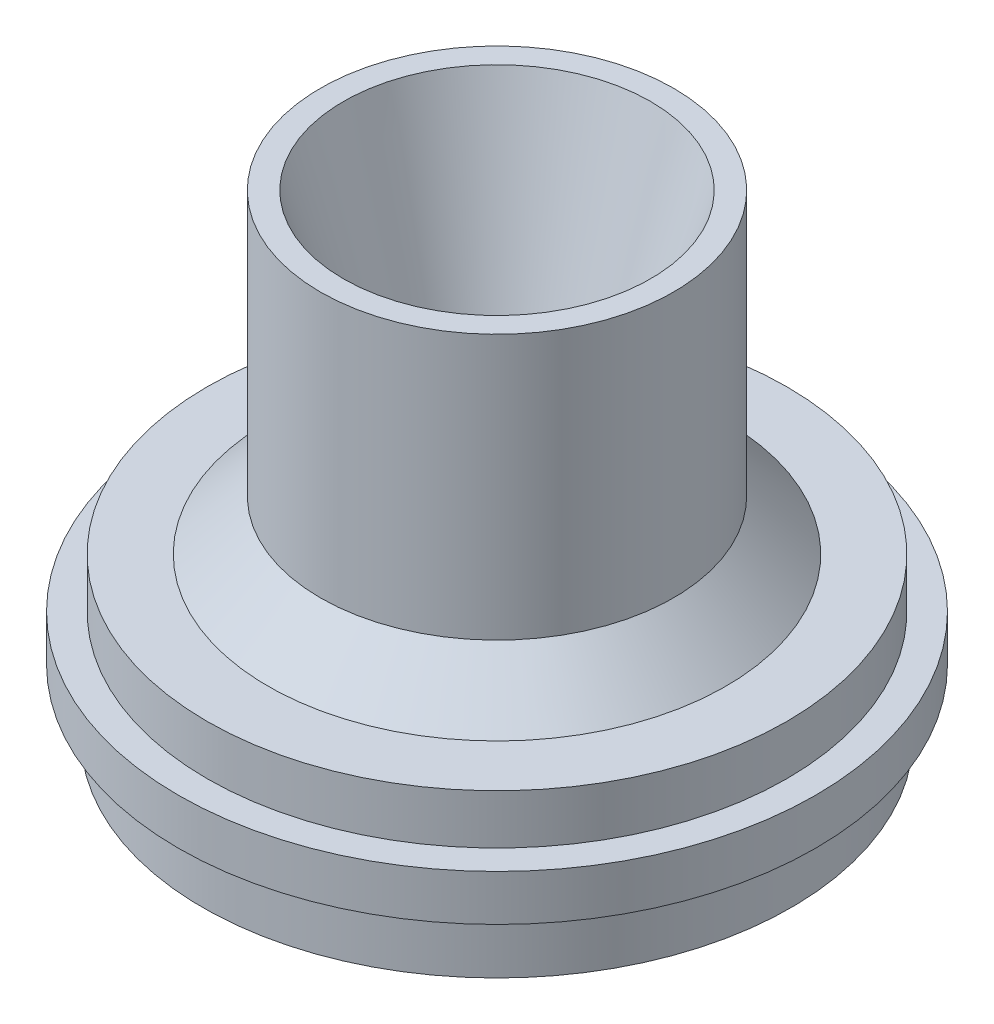
ISO-10303-21;
HEADER;
FILE_DESCRIPTION(('STEP AP214'),'2;1');
FILE_NAME('part.step','',(''),(''),'','','');
FILE_SCHEMA(('AUTOMOTIVE_DESIGN { 1 0 10303 214 1 1 1 1 }'));
ENDSEC;
DATA;
#1=APPLICATION_CONTEXT('core data for automotive mechanical design processes');
#2=APPLICATION_PROTOCOL_DEFINITION('international standard','automotive_design',2000,#1);
#3=PRODUCT_CONTEXT('',#1,'mechanical');
#4=PRODUCT('Part','Part','',(#3));
#5=PRODUCT_RELATED_PRODUCT_CATEGORY('part','',(#4));
#6=PRODUCT_DEFINITION_FORMATION('','',#4);
#7=PRODUCT_DEFINITION_CONTEXT('part definition',#1,'design');
#8=PRODUCT_DEFINITION('design','',#6,#7);
#9=PRODUCT_DEFINITION_SHAPE('','',#8);
#10=(LENGTH_UNIT() NAMED_UNIT(*) SI_UNIT(.MILLI.,.METRE.));
#11=(NAMED_UNIT(*) PLANE_ANGLE_UNIT() SI_UNIT($,.RADIAN.));
#12=(NAMED_UNIT(*) SI_UNIT($,.STERADIAN.) SOLID_ANGLE_UNIT());
#13=UNCERTAINTY_MEASURE_WITH_UNIT(LENGTH_MEASURE(1.E-05),#10,'distance_accuracy_value','');
#14=(GEOMETRIC_REPRESENTATION_CONTEXT(3) GLOBAL_UNCERTAINTY_ASSIGNED_CONTEXT((#13)) GLOBAL_UNIT_ASSIGNED_CONTEXT((#10,
#11,#12)) REPRESENTATION_CONTEXT('',''));
#15=CARTESIAN_POINT('',(0.,0.,0.));
#16=DIRECTION('',(0.,0.,1.));
#17=DIRECTION('',(1.,0.,0.));
#18=AXIS2_PLACEMENT_3D('',#15,#16,#17);
#19=CARTESIAN_POINT('',(0.,0.,0.));
#20=DIRECTION('',(0.,-1.,0.));
#21=DIRECTION('',(0.,0.,-1.));
#22=AXIS2_PLACEMENT_3D('',#19,#20,#21);
#23=CYLINDRICAL_SURFACE('',#22,42.3185589062585);
#24=CARTESIAN_POINT('',(0.,-42.8244,0.));
#25=DIRECTION('',(0.,-1.,0.));
#26=DIRECTION('',(0.,0.,-1.));
#27=AXIS2_PLACEMENT_3D('',#24,#25,#26);
#28=CIRCLE('',#27,42.3185589062585);
#29=CARTESIAN_POINT('',(0.,-42.8244,-42.3185589062585));
#30=VERTEX_POINT('',#29);
#31=EDGE_CURVE('E10',#30,#30,#28,.T.);
#32=ORIENTED_EDGE('',*,*,#31,.F.);
#33=EDGE_LOOP('',(#32));
#34=FACE_BOUND('',#33,.T.);
#35=CARTESIAN_POINT('',(0.,-33.6804,0.));
#36=DIRECTION('',(0.,-1.,0.));
#37=DIRECTION('',(0.,0.,-1.));
#38=AXIS2_PLACEMENT_3D('',#35,#36,#37);
#39=CIRCLE('',#38,42.3185589062585);
#40=CARTESIAN_POINT('',(0.,-33.6804,-42.3185589062585));
#41=VERTEX_POINT('',#40);
#42=EDGE_CURVE('E91',#41,#41,#39,.T.);
#43=ORIENTED_EDGE('',*,*,#42,.T.);
#44=EDGE_LOOP('',(#43));
#45=FACE_BOUND('',#44,.T.);
#46=ADVANCED_FACE('F35',(#34,#45),#23,.T.);
#47=CARTESIAN_POINT('',(-35.0647,-42.8244,0.));
#48=DIRECTION('',(0.,1.,0.));
#49=DIRECTION('',(0.,0.,1.));
#50=AXIS2_PLACEMENT_3D('',#47,#48,#49);
#51=PLANE('',#50);
#52=CARTESIAN_POINT('',(0.,-42.8244,0.));
#53=DIRECTION('',(0.,-1.,0.));
#54=DIRECTION('',(0.,0.,-1.));
#55=AXIS2_PLACEMENT_3D('',#52,#53,#54);
#56=CIRCLE('',#55,35.0647);
#57=CARTESIAN_POINT('',(0.,-42.8244,-35.0647));
#58=VERTEX_POINT('',#57);
#59=EDGE_CURVE('E42',#58,#58,#56,.T.);
#60=ORIENTED_EDGE('',*,*,#59,.F.);
#61=EDGE_LOOP('',(#60));
#62=FACE_BOUND('',#61,.T.);
#63=ORIENTED_EDGE('',*,*,#31,.T.);
#64=EDGE_LOOP('',(#63));
#65=FACE_BOUND('',#64,.T.);
#66=ADVANCED_FACE('F158',(#62,#65),#51,.F.);
#67=CARTESIAN_POINT('',(0.,-42.8244,0.));
#68=DIRECTION('',(0.,-1.,0.));
#69=DIRECTION('',(0.,0.,-1.));
#70=AXIS2_PLACEMENT_3D('',#67,#68,#69);
#71=CONICAL_SURFACE('',#70,35.0647,1.06615947241983);
#72=CARTESIAN_POINT('',(0.,-30.226,0.));
#73=DIRECTION('',(0.,-1.,0.));
#74=DIRECTION('',(0.,0.,-1.));
#75=AXIS2_PLACEMENT_3D('',#72,#73,#74);
#76=CIRCLE('',#75,12.2555);
#77=CARTESIAN_POINT('',(0.,-30.226,-12.2555));
#78=VERTEX_POINT('',#77);
#79=EDGE_CURVE('E49',#78,#78,#76,.T.);
#80=ORIENTED_EDGE('',*,*,#79,.F.);
#81=EDGE_LOOP('',(#80));
#82=FACE_BOUND('',#81,.T.);
#83=ORIENTED_EDGE('',*,*,#59,.T.);
#84=EDGE_LOOP('',(#83));
#85=FACE_BOUND('',#84,.T.);
#86=ADVANCED_FACE('F153',(#82,#85),#71,.F.);
#87=CARTESIAN_POINT('',(0.,0.,0.));
#88=DIRECTION('',(0.,-1.,0.));
#89=DIRECTION('',(0.,0.,-1.));
#90=AXIS2_PLACEMENT_3D('',#87,#88,#89);
#91=CYLINDRICAL_SURFACE('',#90,12.2555);
#92=CARTESIAN_POINT('',(0.,-7.366,0.));
#93=DIRECTION('',(0.,-1.,0.));
#94=DIRECTION('',(0.,0.,-1.));
#95=AXIS2_PLACEMENT_3D('',#92,#93,#94);
#96=CIRCLE('',#95,12.2555);
#97=CARTESIAN_POINT('',(0.,-7.366,-12.2555));
#98=VERTEX_POINT('',#97);
#99=EDGE_CURVE('E55',#98,#98,#96,.T.);
#100=ORIENTED_EDGE('',*,*,#99,.F.);
#101=EDGE_LOOP('',(#100));
#102=FACE_BOUND('',#101,.T.);
#103=ORIENTED_EDGE('',*,*,#79,.T.);
#104=EDGE_LOOP('',(#103));
#105=FACE_BOUND('',#104,.T.);
#106=ADVANCED_FACE('F147',(#102,#105),#91,.F.);
#107=CARTESIAN_POINT('',(0.,-7.366,0.));
#108=DIRECTION('',(0.,1.,0.));
#109=DIRECTION('',(0.,0.,1.));
#110=AXIS2_PLACEMENT_3D('',#107,#108,#109);
#111=CONICAL_SURFACE('',#110,12.2555,0.29181235001844);
#112=CARTESIAN_POINT('',(0.,25.4,0.));
#113=DIRECTION('',(0.,-1.,0.));
#114=DIRECTION('',(0.,0.,-1.));
#115=AXIS2_PLACEMENT_3D('',#112,#113,#114);
#116=CIRCLE('',#115,22.098);
#117=CARTESIAN_POINT('',(0.,25.4,-22.098));
#118=VERTEX_POINT('',#117);
#119=EDGE_CURVE('E61',#118,#118,#116,.T.);
#120=ORIENTED_EDGE('',*,*,#119,.F.);
#121=EDGE_LOOP('',(#120));
#122=FACE_BOUND('',#121,.T.);
#123=ORIENTED_EDGE('',*,*,#99,.T.);
#124=EDGE_LOOP('',(#123));
#125=FACE_BOUND('',#124,.T.);
#126=ADVANCED_FACE('F141',(#122,#125),#111,.F.);
#127=CARTESIAN_POINT('',(-25.4,25.4,0.));
#128=DIRECTION('',(0.,-1.,0.));
#129=DIRECTION('',(0.,0.,-1.));
#130=AXIS2_PLACEMENT_3D('',#127,#128,#129);
#131=PLANE('',#130);
#132=CARTESIAN_POINT('',(0.,25.4,0.));
#133=DIRECTION('',(0.,-1.,0.));
#134=DIRECTION('',(0.,0.,-1.));
#135=AXIS2_PLACEMENT_3D('',#132,#133,#134);
#136=CIRCLE('',#135,25.4);
#137=CARTESIAN_POINT('',(0.,25.4,-25.4));
#138=VERTEX_POINT('',#137);
#139=EDGE_CURVE('E65',#138,#138,#136,.T.);
#140=ORIENTED_EDGE('',*,*,#139,.F.);
#141=EDGE_LOOP('',(#140));
#142=FACE_BOUND('',#141,.T.);
#143=ORIENTED_EDGE('',*,*,#119,.T.);
#144=EDGE_LOOP('',(#143));
#145=FACE_BOUND('',#144,.T.);
#146=ADVANCED_FACE('F135',(#142,#145),#131,.F.);
#147=CARTESIAN_POINT('',(0.,0.,0.));
#148=DIRECTION('',(0.,-1.,0.));
#149=DIRECTION('',(0.,0.,-1.));
#150=AXIS2_PLACEMENT_3D('',#147,#148,#149);
#151=CYLINDRICAL_SURFACE('',#150,25.4);
#152=CARTESIAN_POINT('',(0.,-12.7,0.));
#153=DIRECTION('',(0.,-1.,0.));
#154=DIRECTION('',(0.,0.,-1.));
#155=AXIS2_PLACEMENT_3D('',#152,#153,#154);
#156=CIRCLE('',#155,25.4);
#157=CARTESIAN_POINT('',(0.,-12.7,-25.4));
#158=VERTEX_POINT('',#157);
#159=EDGE_CURVE('E69',#158,#158,#156,.T.);
#160=ORIENTED_EDGE('',*,*,#159,.F.);
#161=EDGE_LOOP('',(#160));
#162=FACE_BOUND('',#161,.T.);
#163=ORIENTED_EDGE('',*,*,#139,.T.);
#164=EDGE_LOOP('',(#163));
#165=FACE_BOUND('',#164,.T.);
#166=ADVANCED_FACE('F129',(#162,#165),#151,.T.);
#167=CARTESIAN_POINT('',(0.,-12.7,0.));
#168=DIRECTION('',(0.,-1.,0.));
#169=DIRECTION('',(0.,0.,-1.));
#170=AXIS2_PLACEMENT_3D('',#167,#168,#169);
#171=CONICAL_SURFACE('',#170,25.4,0.805172026004439);
#172=CARTESIAN_POINT('',(0.,-19.939,0.));
#173=DIRECTION('',(0.,-1.,0.));
#174=DIRECTION('',(0.,0.,-1.));
#175=AXIS2_PLACEMENT_3D('',#172,#173,#174);
#176=CIRCLE('',#175,32.9311);
#177=CARTESIAN_POINT('',(0.,-19.939,-32.9311));
#178=VERTEX_POINT('',#177);
#179=EDGE_CURVE('E73',#178,#178,#176,.T.);
#180=ORIENTED_EDGE('',*,*,#179,.F.);
#181=EDGE_LOOP('',(#180));
#182=FACE_BOUND('',#181,.T.);
#183=ORIENTED_EDGE('',*,*,#159,.T.);
#184=EDGE_LOOP('',(#183));
#185=FACE_BOUND('',#184,.T.);
#186=ADVANCED_FACE('F123',(#182,#185),#171,.T.);
#187=CARTESIAN_POINT('',(-41.6941,-19.939,0.));
#188=DIRECTION('',(0.,-1.,0.));
#189=DIRECTION('',(0.,0.,-1.));
#190=AXIS2_PLACEMENT_3D('',#187,#188,#189);
#191=PLANE('',#190);
#192=CARTESIAN_POINT('',(0.,-19.939,0.));
#193=DIRECTION('',(0.,-1.,0.));
#194=DIRECTION('',(0.,0.,-1.));
#195=AXIS2_PLACEMENT_3D('',#192,#193,#194);
#196=CIRCLE('',#195,41.6941);
#197=CARTESIAN_POINT('',(0.,-19.939,-41.6941));
#198=VERTEX_POINT('',#197);
#199=EDGE_CURVE('E77',#198,#198,#196,.T.);
#200=ORIENTED_EDGE('',*,*,#199,.F.);
#201=EDGE_LOOP('',(#200));
#202=FACE_BOUND('',#201,.T.);
#203=ORIENTED_EDGE('',*,*,#179,.T.);
#204=EDGE_LOOP('',(#203));
#205=FACE_BOUND('',#204,.T.);
#206=ADVANCED_FACE('F117',(#202,#205),#191,.F.);
#207=CARTESIAN_POINT('',(0.,0.,0.));
#208=DIRECTION('',(0.,-1.,0.));
#209=DIRECTION('',(0.,0.,-1.));
#210=AXIS2_PLACEMENT_3D('',#207,#208,#209);
#211=CYLINDRICAL_SURFACE('',#210,41.6941);
#212=CARTESIAN_POINT('',(0.,-27.0764,0.));
#213=DIRECTION('',(0.,-1.,0.));
#214=DIRECTION('',(0.,0.,-1.));
#215=AXIS2_PLACEMENT_3D('',#212,#213,#214);
#216=CIRCLE('',#215,41.6941);
#217=CARTESIAN_POINT('',(0.,-27.0764,-41.6941));
#218=VERTEX_POINT('',#217);
#219=EDGE_CURVE('E81',#218,#218,#216,.T.);
#220=ORIENTED_EDGE('',*,*,#219,.F.);
#221=EDGE_LOOP('',(#220));
#222=FACE_BOUND('',#221,.T.);
#223=ORIENTED_EDGE('',*,*,#199,.T.);
#224=EDGE_LOOP('',(#223));
#225=FACE_BOUND('',#224,.T.);
#226=ADVANCED_FACE('F111',(#222,#225),#211,.T.);
#227=CARTESIAN_POINT('',(-45.8216,-27.0764,0.));
#228=DIRECTION('',(0.,-1.,0.));
#229=DIRECTION('',(0.,0.,-1.));
#230=AXIS2_PLACEMENT_3D('',#227,#228,#229);
#231=PLANE('',#230);
#232=CARTESIAN_POINT('',(0.,-27.0764,0.));
#233=DIRECTION('',(0.,-1.,0.));
#234=DIRECTION('',(0.,0.,-1.));
#235=AXIS2_PLACEMENT_3D('',#232,#233,#234);
#236=CIRCLE('',#235,45.8216);
#237=CARTESIAN_POINT('',(0.,-27.0764,-45.8216));
#238=VERTEX_POINT('',#237);
#239=EDGE_CURVE('E85',#238,#238,#236,.T.);
#240=ORIENTED_EDGE('',*,*,#239,.F.);
#241=EDGE_LOOP('',(#240));
#242=FACE_BOUND('',#241,.T.);
#243=ORIENTED_EDGE('',*,*,#219,.T.);
#244=EDGE_LOOP('',(#243));
#245=FACE_BOUND('',#244,.T.);
#246=ADVANCED_FACE('F105',(#242,#245),#231,.F.);
#247=CARTESIAN_POINT('',(0.,0.,0.));
#248=DIRECTION('',(0.,-1.,0.));
#249=DIRECTION('',(0.,0.,-1.));
#250=AXIS2_PLACEMENT_3D('',#247,#248,#249);
#251=CYLINDRICAL_SURFACE('',#250,45.8216);
#252=CARTESIAN_POINT('',(0.,-33.6804,0.));
#253=DIRECTION('',(0.,-1.,0.));
#254=DIRECTION('',(0.,0.,-1.));
#255=AXIS2_PLACEMENT_3D('',#252,#253,#254);
#256=CIRCLE('',#255,45.8216);
#257=CARTESIAN_POINT('',(0.,-33.6804,-45.8216));
#258=VERTEX_POINT('',#257);
#259=EDGE_CURVE('E88',#258,#258,#256,.T.);
#260=ORIENTED_EDGE('',*,*,#259,.F.);
#261=EDGE_LOOP('',(#260));
#262=FACE_BOUND('',#261,.T.);
#263=ORIENTED_EDGE('',*,*,#239,.T.);
#264=EDGE_LOOP('',(#263));
#265=FACE_BOUND('',#264,.T.);
#266=ADVANCED_FACE('F99',(#262,#265),#251,.T.);
#267=CARTESIAN_POINT('',(-42.3185589062585,-33.6804,0.));
#268=DIRECTION('',(0.,1.,0.));
#269=DIRECTION('',(0.,0.,1.));
#270=AXIS2_PLACEMENT_3D('',#267,#268,#269);
#271=PLANE('',#270);
#272=ORIENTED_EDGE('',*,*,#42,.F.);
#273=EDGE_LOOP('',(#272));
#274=FACE_BOUND('',#273,.T.);
#275=ORIENTED_EDGE('',*,*,#259,.T.);
#276=EDGE_LOOP('',(#275));
#277=FACE_BOUND('',#276,.T.);
#278=ADVANCED_FACE('F96',(#274,#277),#271,.F.);
#279=CLOSED_SHELL('',(#46,#66,#86,#106,#126,#146,#166,#186,#206,#226,#246,#266,#278));
#280=MANIFOLD_SOLID_BREP('B2',#279);
#281=ADVANCED_BREP_SHAPE_REPRESENTATION('',(#18,#280),#14);
#282=SHAPE_DEFINITION_REPRESENTATION(#9,#281);
ENDSEC;
END-ISO-10303-21;
